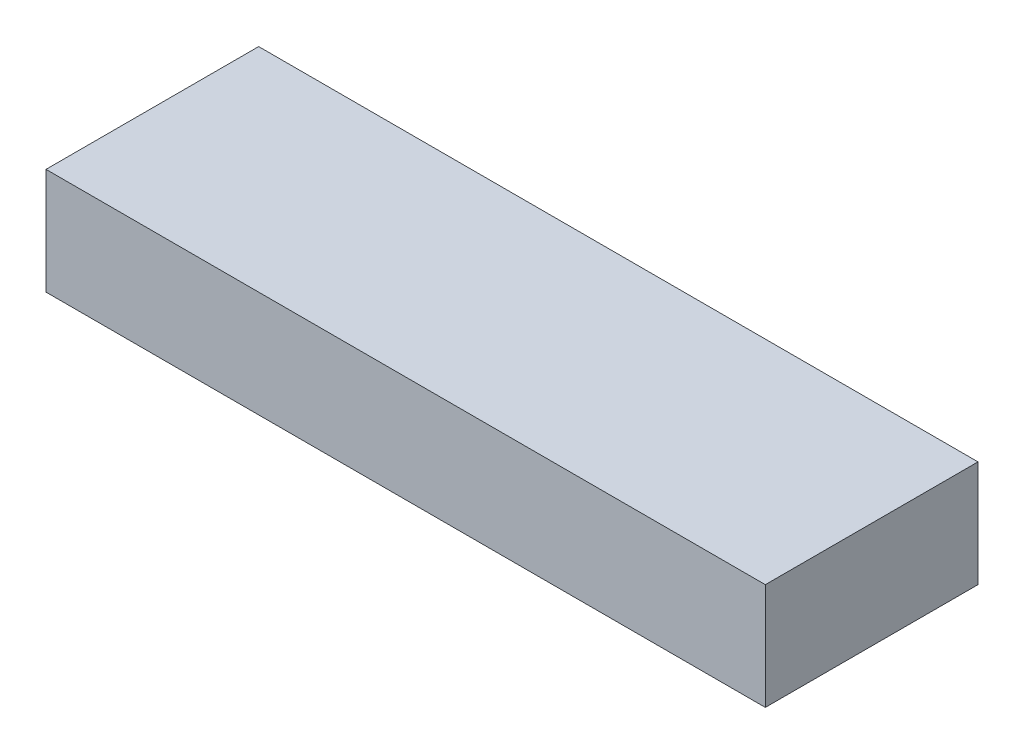
ISO-10303-21;
HEADER;
FILE_DESCRIPTION(('STEP AP214'),'2;1');
FILE_NAME('part.step','',(''),(''),'','','');
FILE_SCHEMA(('AUTOMOTIVE_DESIGN { 1 0 10303 214 1 1 1 1 }'));
ENDSEC;
DATA;
#1=APPLICATION_CONTEXT('core data for automotive mechanical design processes');
#2=APPLICATION_PROTOCOL_DEFINITION('international standard','automotive_design',2000,#1);
#3=PRODUCT_CONTEXT('',#1,'mechanical');
#4=PRODUCT('Part','Part','',(#3));
#5=PRODUCT_RELATED_PRODUCT_CATEGORY('part','',(#4));
#6=PRODUCT_DEFINITION_FORMATION('','',#4);
#7=PRODUCT_DEFINITION_CONTEXT('part definition',#1,'design');
#8=PRODUCT_DEFINITION('design','',#6,#7);
#9=PRODUCT_DEFINITION_SHAPE('','',#8);
#10=(LENGTH_UNIT() NAMED_UNIT(*) SI_UNIT(.MILLI.,.METRE.));
#11=(NAMED_UNIT(*) PLANE_ANGLE_UNIT() SI_UNIT($,.RADIAN.));
#12=(NAMED_UNIT(*) SI_UNIT($,.STERADIAN.) SOLID_ANGLE_UNIT());
#13=UNCERTAINTY_MEASURE_WITH_UNIT(LENGTH_MEASURE(1.E-05),#10,'distance_accuracy_value','');
#14=(GEOMETRIC_REPRESENTATION_CONTEXT(3) GLOBAL_UNCERTAINTY_ASSIGNED_CONTEXT((#13)) GLOBAL_UNIT_ASSIGNED_CONTEXT((#10,
#11,#12)) REPRESENTATION_CONTEXT('',''));
#15=CARTESIAN_POINT('',(0.,0.,0.));
#16=DIRECTION('',(0.,0.,1.));
#17=DIRECTION('',(1.,0.,0.));
#18=AXIS2_PLACEMENT_3D('',#15,#16,#17);
#19=CARTESIAN_POINT('',(73.025,21.59,21.59));
#20=DIRECTION('',(-1.,0.,0.));
#21=DIRECTION('',(0.,0.,1.));
#22=AXIS2_PLACEMENT_3D('',#19,#20,#21);
#23=PLANE('',#22);
#24=DIRECTION('',(0.,0.,-1.));
#25=VECTOR('',#24,1.);
#26=CARTESIAN_POINT('',(73.025,0.,21.59));
#27=LINE('',#26,#25);
#28=CARTESIAN_POINT('',(73.025,0.,21.59));
#29=VERTEX_POINT('',#28);
#30=CARTESIAN_POINT('',(73.025,0.,-21.59));
#31=VERTEX_POINT('',#30);
#32=EDGE_CURVE('E94',#29,#31,#27,.T.);
#33=ORIENTED_EDGE('',*,*,#32,.T.);
#34=DIRECTION('',(0.,-1.,0.));
#35=VECTOR('',#34,1.);
#36=CARTESIAN_POINT('',(73.025,21.59,-21.59));
#37=LINE('',#36,#35);
#38=CARTESIAN_POINT('',(73.025,21.59,-21.59));
#39=VERTEX_POINT('',#38);
#40=EDGE_CURVE('E11',#39,#31,#37,.T.);
#41=ORIENTED_EDGE('',*,*,#40,.F.);
#42=DIRECTION('',(0.,0.,-1.));
#43=VECTOR('',#42,1.);
#44=CARTESIAN_POINT('',(73.025,21.59,21.59));
#45=LINE('',#44,#43);
#46=CARTESIAN_POINT('',(73.025,21.59,21.59));
#47=VERTEX_POINT('',#46);
#48=EDGE_CURVE('E82',#47,#39,#45,.T.);
#49=ORIENTED_EDGE('',*,*,#48,.F.);
#50=DIRECTION('',(0.,-1.,0.));
#51=VECTOR('',#50,1.);
#52=CARTESIAN_POINT('',(73.025,21.59,21.59));
#53=LINE('',#52,#51);
#54=EDGE_CURVE('E90',#47,#29,#53,.T.);
#55=ORIENTED_EDGE('',*,*,#54,.T.);
#56=EDGE_LOOP('',(#33,#41,#49,#55));
#57=FACE_BOUND('',#56,.T.);
#58=ADVANCED_FACE('F31',(#57),#23,.F.);
#59=CARTESIAN_POINT('',(-73.025,21.59,-21.59));
#60=DIRECTION('',(0.,0.,1.));
#61=DIRECTION('',(1.,0.,0.));
#62=AXIS2_PLACEMENT_3D('',#59,#60,#61);
#63=PLANE('',#62);
#64=DIRECTION('',(-1.,0.,0.));
#65=VECTOR('',#64,1.);
#66=CARTESIAN_POINT('',(-73.025,0.,-21.59));
#67=LINE('',#66,#65);
#68=CARTESIAN_POINT('',(-73.025,0.,-21.59));
#69=VERTEX_POINT('',#68);
#70=EDGE_CURVE('E86',#31,#69,#67,.T.);
#71=ORIENTED_EDGE('',*,*,#70,.T.);
#72=DIRECTION('',(0.,-1.,0.));
#73=VECTOR('',#72,1.);
#74=CARTESIAN_POINT('',(-73.025,21.59,-21.59));
#75=LINE('',#74,#73);
#76=CARTESIAN_POINT('',(-73.025,21.59,-21.59));
#77=VERTEX_POINT('',#76);
#78=EDGE_CURVE('E39',#77,#69,#75,.T.);
#79=ORIENTED_EDGE('',*,*,#78,.F.);
#80=DIRECTION('',(-1.,0.,0.));
#81=VECTOR('',#80,1.);
#82=CARTESIAN_POINT('',(-73.025,21.59,-21.59));
#83=LINE('',#82,#81);
#84=EDGE_CURVE('E77',#39,#77,#83,.T.);
#85=ORIENTED_EDGE('',*,*,#84,.F.);
#86=ORIENTED_EDGE('',*,*,#40,.T.);
#87=EDGE_LOOP('',(#71,#79,#85,#86));
#88=FACE_BOUND('',#87,.T.);
#89=ADVANCED_FACE('F85',(#88),#63,.F.);
#90=CARTESIAN_POINT('',(-73.025,21.59,21.59));
#91=DIRECTION('',(1.,0.,0.));
#92=DIRECTION('',(0.,0.,-1.));
#93=AXIS2_PLACEMENT_3D('',#90,#91,#92);
#94=PLANE('',#93);
#95=DIRECTION('',(0.,0.,1.));
#96=VECTOR('',#95,1.);
#97=CARTESIAN_POINT('',(-73.025,0.,21.59));
#98=LINE('',#97,#96);
#99=CARTESIAN_POINT('',(-73.025,0.,21.59));
#100=VERTEX_POINT('',#99);
#101=EDGE_CURVE('E64',#69,#100,#98,.T.);
#102=ORIENTED_EDGE('',*,*,#101,.T.);
#103=DIRECTION('',(0.,-1.,0.));
#104=VECTOR('',#103,1.);
#105=CARTESIAN_POINT('',(-73.025,21.59,21.59));
#106=LINE('',#105,#104);
#107=CARTESIAN_POINT('',(-73.025,21.59,21.59));
#108=VERTEX_POINT('',#107);
#109=EDGE_CURVE('E87',#108,#100,#106,.T.);
#110=ORIENTED_EDGE('',*,*,#109,.F.);
#111=DIRECTION('',(0.,0.,1.));
#112=VECTOR('',#111,1.);
#113=CARTESIAN_POINT('',(-73.025,21.59,21.59));
#114=LINE('',#113,#112);
#115=EDGE_CURVE('E80',#77,#108,#114,.T.);
#116=ORIENTED_EDGE('',*,*,#115,.F.);
#117=ORIENTED_EDGE('',*,*,#78,.T.);
#118=EDGE_LOOP('',(#102,#110,#116,#117));
#119=FACE_BOUND('',#118,.T.);
#120=ADVANCED_FACE('F88',(#119),#94,.F.);
#121=CARTESIAN_POINT('',(-73.025,21.59,21.59));
#122=DIRECTION('',(0.,0.,-1.));
#123=DIRECTION('',(-1.,0.,0.));
#124=AXIS2_PLACEMENT_3D('',#121,#122,#123);
#125=PLANE('',#124);
#126=DIRECTION('',(1.,0.,0.));
#127=VECTOR('',#126,1.);
#128=CARTESIAN_POINT('',(-73.025,0.,21.59));
#129=LINE('',#128,#127);
#130=EDGE_CURVE('E70',#100,#29,#129,.T.);
#131=ORIENTED_EDGE('',*,*,#130,.T.);
#132=ORIENTED_EDGE('',*,*,#54,.F.);
#133=DIRECTION('',(1.,0.,0.));
#134=VECTOR('',#133,1.);
#135=CARTESIAN_POINT('',(-73.025,21.59,21.59));
#136=LINE('',#135,#134);
#137=EDGE_CURVE('E47',#108,#47,#136,.T.);
#138=ORIENTED_EDGE('',*,*,#137,.F.);
#139=ORIENTED_EDGE('',*,*,#109,.T.);
#140=EDGE_LOOP('',(#131,#132,#138,#139));
#141=FACE_BOUND('',#140,.T.);
#142=ADVANCED_FACE('F101',(#141),#125,.F.);
#143=CARTESIAN_POINT('',(73.025,21.59,-21.59));
#144=DIRECTION('',(0.,-1.,0.));
#145=DIRECTION('',(0.,0.,-1.));
#146=AXIS2_PLACEMENT_3D('',#143,#144,#145);
#147=PLANE('',#146);
#148=ORIENTED_EDGE('',*,*,#48,.T.);
#149=ORIENTED_EDGE('',*,*,#84,.T.);
#150=ORIENTED_EDGE('',*,*,#115,.T.);
#151=ORIENTED_EDGE('',*,*,#137,.T.);
#152=EDGE_LOOP('',(#148,#149,#150,#151));
#153=FACE_BOUND('',#152,.T.);
#154=ADVANCED_FACE('F78',(#153),#147,.F.);
#155=CARTESIAN_POINT('',(73.025,0.,-21.59));
#156=DIRECTION('',(0.,-1.,0.));
#157=DIRECTION('',(0.,0.,-1.));
#158=AXIS2_PLACEMENT_3D('',#155,#156,#157);
#159=PLANE('',#158);
#160=ORIENTED_EDGE('',*,*,#32,.F.);
#161=ORIENTED_EDGE('',*,*,#130,.F.);
#162=ORIENTED_EDGE('',*,*,#101,.F.);
#163=ORIENTED_EDGE('',*,*,#70,.F.);
#164=EDGE_LOOP('',(#160,#161,#162,#163));
#165=FACE_BOUND('',#164,.T.);
#166=ADVANCED_FACE('F104',(#165),#159,.T.);
#167=CLOSED_SHELL('',(#58,#89,#120,#142,#154,#166));
#168=MANIFOLD_SOLID_BREP('B2',#167);
#169=ADVANCED_BREP_SHAPE_REPRESENTATION('',(#18,#168),#14);
#170=SHAPE_DEFINITION_REPRESENTATION(#9,#169);
ENDSEC;
END-ISO-10303-21;
